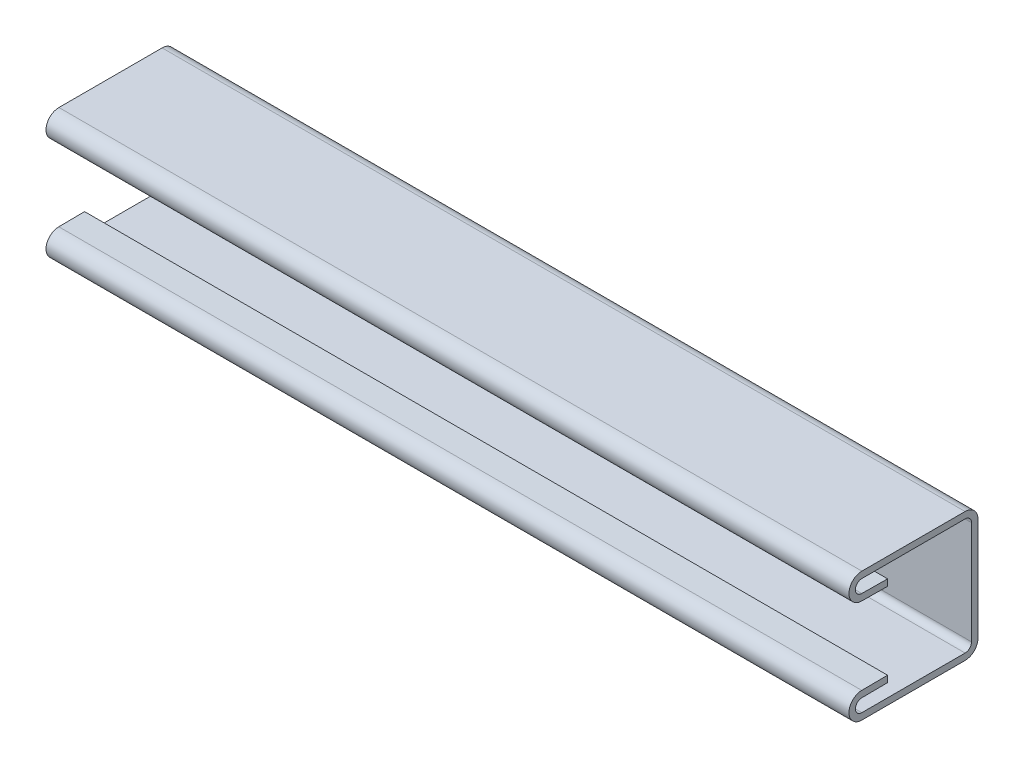
ISO-10303-21;
HEADER;
FILE_DESCRIPTION(('STEP AP214'),'2;1');
FILE_NAME('part.step','',(''),(''),'','','');
FILE_SCHEMA(('AUTOMOTIVE_DESIGN { 1 0 10303 214 1 1 1 1 }'));
ENDSEC;
DATA;
#1=APPLICATION_CONTEXT('core data for automotive mechanical design processes');
#2=APPLICATION_PROTOCOL_DEFINITION('international standard','automotive_design',2000,#1);
#3=PRODUCT_CONTEXT('',#1,'mechanical');
#4=PRODUCT('Part','Part','',(#3));
#5=PRODUCT_RELATED_PRODUCT_CATEGORY('part','',(#4));
#6=PRODUCT_DEFINITION_FORMATION('','',#4);
#7=PRODUCT_DEFINITION_CONTEXT('part definition',#1,'design');
#8=PRODUCT_DEFINITION('design','',#6,#7);
#9=PRODUCT_DEFINITION_SHAPE('','',#8);
#10=(LENGTH_UNIT() NAMED_UNIT(*) SI_UNIT(.MILLI.,.METRE.));
#11=(NAMED_UNIT(*) PLANE_ANGLE_UNIT() SI_UNIT($,.RADIAN.));
#12=(NAMED_UNIT(*) SI_UNIT($,.STERADIAN.) SOLID_ANGLE_UNIT());
#13=UNCERTAINTY_MEASURE_WITH_UNIT(LENGTH_MEASURE(1.E-05),#10,'distance_accuracy_value','');
#14=(GEOMETRIC_REPRESENTATION_CONTEXT(3) GLOBAL_UNCERTAINTY_ASSIGNED_CONTEXT((#13)) GLOBAL_UNIT_ASSIGNED_CONTEXT((#10,
#11,#12)) REPRESENTATION_CONTEXT('',''));
#15=CARTESIAN_POINT('',(0.,0.,0.));
#16=DIRECTION('',(0.,0.,1.));
#17=DIRECTION('',(1.,0.,0.));
#18=AXIS2_PLACEMENT_3D('',#15,#16,#17);
#19=CARTESIAN_POINT('',(-124.457734282082,8.,8.));
#20=DIRECTION('',(1.,0.,0.));
#21=DIRECTION('',(0.,0.,-1.));
#22=AXIS2_PLACEMENT_3D('',#19,#20,#21);
#23=CYLINDRICAL_SURFACE('',#22,2.);
#24=CARTESIAN_POINT('',(0.,8.,8.));
#25=DIRECTION('',(-1.,0.,0.));
#26=DIRECTION('',(0.,0.,-1.));
#27=AXIS2_PLACEMENT_3D('',#24,#25,#26);
#28=CIRCLE('',#27,2.);
#29=CARTESIAN_POINT('',(0.,6.00007615387166,8.01745307099674));
#30=VERTEX_POINT('',#29);
#31=CARTESIAN_POINT('',(0.,10.,8.));
#32=VERTEX_POINT('',#31);
#33=EDGE_CURVE('E267',#30,#32,#28,.T.);
#34=ORIENTED_EDGE('',*,*,#33,.T.);
#35=DIRECTION('',(1.,0.,0.));
#36=VECTOR('',#35,1.);
#37=CARTESIAN_POINT('',(-124.457734282082,10.,8.));
#38=LINE('',#37,#36);
#39=CARTESIAN_POINT('',(-124.457734282082,10.,8.));
#40=VERTEX_POINT('',#39);
#41=EDGE_CURVE('E13',#40,#32,#38,.T.);
#42=ORIENTED_EDGE('',*,*,#41,.F.);
#43=CARTESIAN_POINT('',(-124.457734282082,8.,8.));
#44=DIRECTION('',(-1.,0.,0.));
#45=DIRECTION('',(0.,0.,-1.));
#46=AXIS2_PLACEMENT_3D('',#43,#44,#45);
#47=CIRCLE('',#46,2.);
#48=CARTESIAN_POINT('',(-124.457734282082,6.00007615387166,8.01745307099674));
#49=VERTEX_POINT('',#48);
#50=EDGE_CURVE('E305',#49,#40,#47,.T.);
#51=ORIENTED_EDGE('',*,*,#50,.F.);
#52=DIRECTION('',(1.,0.,0.));
#53=VECTOR('',#52,1.);
#54=CARTESIAN_POINT('',(-124.457734282082,6.00007615387166,8.01745307099674));
#55=LINE('',#54,#53);
#56=EDGE_CURVE('E263',#49,#30,#55,.T.);
#57=ORIENTED_EDGE('',*,*,#56,.T.);
#58=EDGE_LOOP('',(#34,#42,#51,#57));
#59=FACE_BOUND('',#58,.T.);
#60=ADVANCED_FACE('F99',(#59),#23,.T.);
#61=CARTESIAN_POINT('',(-124.457734282082,10.,-8.));
#62=DIRECTION('',(0.,-1.,0.));
#63=DIRECTION('',(0.,0.,-1.));
#64=AXIS2_PLACEMENT_3D('',#61,#62,#63);
#65=PLANE('',#64);
#66=DIRECTION('',(0.,0.,-1.));
#67=VECTOR('',#66,1.);
#68=CARTESIAN_POINT('',(0.,10.,-8.));
#69=LINE('',#68,#67);
#70=CARTESIAN_POINT('',(0.,10.,-8.));
#71=VERTEX_POINT('',#70);
#72=EDGE_CURVE('E270',#32,#71,#69,.T.);
#73=ORIENTED_EDGE('',*,*,#72,.T.);
#74=DIRECTION('',(1.,0.,0.));
#75=VECTOR('',#74,1.);
#76=CARTESIAN_POINT('',(-124.457734282082,10.,-8.));
#77=LINE('',#76,#75);
#78=CARTESIAN_POINT('',(-124.457734282082,10.,-8.));
#79=VERTEX_POINT('',#78);
#80=EDGE_CURVE('E107',#79,#71,#77,.T.);
#81=ORIENTED_EDGE('',*,*,#80,.F.);
#82=DIRECTION('',(0.,0.,-1.));
#83=VECTOR('',#82,1.);
#84=CARTESIAN_POINT('',(-124.457734282082,10.,-8.));
#85=LINE('',#84,#83);
#86=EDGE_CURVE('E194',#40,#79,#85,.T.);
#87=ORIENTED_EDGE('',*,*,#86,.F.);
#88=ORIENTED_EDGE('',*,*,#41,.T.);
#89=EDGE_LOOP('',(#73,#81,#87,#88));
#90=FACE_BOUND('',#89,.T.);
#91=ADVANCED_FACE('F423',(#90),#65,.F.);
#92=CARTESIAN_POINT('',(-124.457734282082,8.,-8.));
#93=DIRECTION('',(1.,0.,0.));
#94=DIRECTION('',(0.,0.,-1.));
#95=AXIS2_PLACEMENT_3D('',#92,#93,#94);
#96=CYLINDRICAL_SURFACE('',#95,2.);
#97=CARTESIAN_POINT('',(0.,8.,-8.));
#98=DIRECTION('',(-1.,0.,0.));
#99=DIRECTION('',(0.,0.,1.));
#100=AXIS2_PLACEMENT_3D('',#97,#98,#99);
#101=CIRCLE('',#100,2.);
#102=CARTESIAN_POINT('',(0.,8.,-10.));
#103=VERTEX_POINT('',#102);
#104=EDGE_CURVE('E272',#71,#103,#101,.T.);
#105=ORIENTED_EDGE('',*,*,#104,.T.);
#106=DIRECTION('',(1.,0.,0.));
#107=VECTOR('',#106,1.);
#108=CARTESIAN_POINT('',(-124.457734282082,8.,-10.));
#109=LINE('',#108,#107);
#110=CARTESIAN_POINT('',(-124.457734282082,8.,-10.));
#111=VERTEX_POINT('',#110);
#112=EDGE_CURVE('E348',#111,#103,#109,.T.);
#113=ORIENTED_EDGE('',*,*,#112,.F.);
#114=CARTESIAN_POINT('',(-124.457734282082,8.,-8.));
#115=DIRECTION('',(-1.,0.,0.));
#116=DIRECTION('',(0.,0.,1.));
#117=AXIS2_PLACEMENT_3D('',#114,#115,#116);
#118=CIRCLE('',#117,2.);
#119=EDGE_CURVE('E356',#79,#111,#118,.T.);
#120=ORIENTED_EDGE('',*,*,#119,.F.);
#121=ORIENTED_EDGE('',*,*,#80,.T.);
#122=EDGE_LOOP('',(#105,#113,#120,#121));
#123=FACE_BOUND('',#122,.T.);
#124=ADVANCED_FACE('F354',(#123),#96,.T.);
#125=CARTESIAN_POINT('',(-124.457734282082,8.,-10.));
#126=DIRECTION('',(0.,0.,1.));
#127=DIRECTION('',(1.,0.,0.));
#128=AXIS2_PLACEMENT_3D('',#125,#126,#127);
#129=PLANE('',#128);
#130=DIRECTION('',(0.,-1.,0.));
#131=VECTOR('',#130,1.);
#132=CARTESIAN_POINT('',(0.,8.,-10.));
#133=LINE('',#132,#131);
#134=CARTESIAN_POINT('',(0.,-8.,-10.));
#135=VERTEX_POINT('',#134);
#136=EDGE_CURVE('E274',#103,#135,#133,.T.);
#137=ORIENTED_EDGE('',*,*,#136,.T.);
#138=DIRECTION('',(1.,0.,0.));
#139=VECTOR('',#138,1.);
#140=CARTESIAN_POINT('',(-124.457734282082,-8.,-10.));
#141=LINE('',#140,#139);
#142=CARTESIAN_POINT('',(-124.457734282082,-8.,-10.));
#143=VERTEX_POINT('',#142);
#144=EDGE_CURVE('E345',#143,#135,#141,.T.);
#145=ORIENTED_EDGE('',*,*,#144,.F.);
#146=DIRECTION('',(0.,-1.,0.));
#147=VECTOR('',#146,1.);
#148=CARTESIAN_POINT('',(-124.457734282082,8.,-10.));
#149=LINE('',#148,#147);
#150=EDGE_CURVE('E374',#111,#143,#149,.T.);
#151=ORIENTED_EDGE('',*,*,#150,.F.);
#152=ORIENTED_EDGE('',*,*,#112,.T.);
#153=EDGE_LOOP('',(#137,#145,#151,#152));
#154=FACE_BOUND('',#153,.T.);
#155=ADVANCED_FACE('F365',(#154),#129,.F.);
#156=CARTESIAN_POINT('',(-124.457734282082,-8.,-8.));
#157=DIRECTION('',(1.,0.,0.));
#158=DIRECTION('',(0.,0.,-1.));
#159=AXIS2_PLACEMENT_3D('',#156,#157,#158);
#160=CYLINDRICAL_SURFACE('',#159,2.);
#161=CARTESIAN_POINT('',(0.,-8.,-8.));
#162=DIRECTION('',(-1.,0.,0.));
#163=DIRECTION('',(0.,0.,-1.));
#164=AXIS2_PLACEMENT_3D('',#161,#162,#163);
#165=CIRCLE('',#164,2.);
#166=CARTESIAN_POINT('',(0.,-10.,-8.));
#167=VERTEX_POINT('',#166);
#168=EDGE_CURVE('E276',#135,#167,#165,.T.);
#169=ORIENTED_EDGE('',*,*,#168,.T.);
#170=DIRECTION('',(1.,0.,0.));
#171=VECTOR('',#170,1.);
#172=CARTESIAN_POINT('',(-124.457734282082,-10.,-8.));
#173=LINE('',#172,#171);
#174=CARTESIAN_POINT('',(-124.457734282082,-10.,-8.));
#175=VERTEX_POINT('',#174);
#176=EDGE_CURVE('E342',#175,#167,#173,.T.);
#177=ORIENTED_EDGE('',*,*,#176,.F.);
#178=CARTESIAN_POINT('',(-124.457734282082,-8.,-8.));
#179=DIRECTION('',(-1.,0.,0.));
#180=DIRECTION('',(0.,0.,-1.));
#181=AXIS2_PLACEMENT_3D('',#178,#179,#180);
#182=CIRCLE('',#181,2.);
#183=EDGE_CURVE('E371',#143,#175,#182,.T.);
#184=ORIENTED_EDGE('',*,*,#183,.F.);
#185=ORIENTED_EDGE('',*,*,#144,.T.);
#186=EDGE_LOOP('',(#169,#177,#184,#185));
#187=FACE_BOUND('',#186,.T.);
#188=ADVANCED_FACE('F369',(#187),#160,.T.);
#189=CARTESIAN_POINT('',(-124.457734282082,-10.,-8.));
#190=DIRECTION('',(0.,1.,0.));
#191=DIRECTION('',(0.,0.,1.));
#192=AXIS2_PLACEMENT_3D('',#189,#190,#191);
#193=PLANE('',#192);
#194=DIRECTION('',(0.,0.,1.));
#195=VECTOR('',#194,1.);
#196=CARTESIAN_POINT('',(0.,-10.,-8.));
#197=LINE('',#196,#195);
#198=CARTESIAN_POINT('',(0.,-10.,8.));
#199=VERTEX_POINT('',#198);
#200=EDGE_CURVE('E278',#167,#199,#197,.T.);
#201=ORIENTED_EDGE('',*,*,#200,.T.);
#202=DIRECTION('',(1.,0.,0.));
#203=VECTOR('',#202,1.);
#204=CARTESIAN_POINT('',(-124.457734282082,-10.,8.));
#205=LINE('',#204,#203);
#206=CARTESIAN_POINT('',(-124.457734282082,-10.,8.));
#207=VERTEX_POINT('',#206);
#208=EDGE_CURVE('E339',#207,#199,#205,.T.);
#209=ORIENTED_EDGE('',*,*,#208,.F.);
#210=DIRECTION('',(0.,0.,1.));
#211=VECTOR('',#210,1.);
#212=CARTESIAN_POINT('',(-124.457734282082,-10.,-8.));
#213=LINE('',#212,#211);
#214=EDGE_CURVE('E373',#175,#207,#213,.T.);
#215=ORIENTED_EDGE('',*,*,#214,.F.);
#216=ORIENTED_EDGE('',*,*,#176,.T.);
#217=EDGE_LOOP('',(#201,#209,#215,#216));
#218=FACE_BOUND('',#217,.T.);
#219=ADVANCED_FACE('F436',(#218),#193,.F.);
#220=CARTESIAN_POINT('',(-124.457734282082,-8.,8.));
#221=DIRECTION('',(1.,0.,0.));
#222=DIRECTION('',(0.,0.,-1.));
#223=AXIS2_PLACEMENT_3D('',#220,#221,#222);
#224=CYLINDRICAL_SURFACE('',#223,2.);
#225=CARTESIAN_POINT('',(0.,-8.,8.));
#226=DIRECTION('',(-1.,0.,0.));
#227=DIRECTION('',(0.,0.,1.));
#228=AXIS2_PLACEMENT_3D('',#225,#226,#227);
#229=CIRCLE('',#228,2.);
#230=CARTESIAN_POINT('',(0.,-6.00007615387166,8.01745307099674));
#231=VERTEX_POINT('',#230);
#232=EDGE_CURVE('E280',#199,#231,#229,.T.);
#233=ORIENTED_EDGE('',*,*,#232,.T.);
#234=DIRECTION('',(1.,0.,0.));
#235=VECTOR('',#234,1.);
#236=CARTESIAN_POINT('',(-124.457734282082,-6.00007615387166,8.01745307099674));
#237=LINE('',#236,#235);
#238=CARTESIAN_POINT('',(-124.457734282082,-6.00007615387166,8.01745307099674));
#239=VERTEX_POINT('',#238);
#240=EDGE_CURVE('E336',#239,#231,#237,.T.);
#241=ORIENTED_EDGE('',*,*,#240,.F.);
#242=CARTESIAN_POINT('',(-124.457734282082,-8.,8.));
#243=DIRECTION('',(-1.,0.,0.));
#244=DIRECTION('',(0.,0.,1.));
#245=AXIS2_PLACEMENT_3D('',#242,#243,#244);
#246=CIRCLE('',#245,2.);
#247=EDGE_CURVE('E376',#207,#239,#246,.T.);
#248=ORIENTED_EDGE('',*,*,#247,.F.);
#249=ORIENTED_EDGE('',*,*,#208,.T.);
#250=EDGE_LOOP('',(#233,#241,#248,#249));
#251=FACE_BOUND('',#250,.T.);
#252=ADVANCED_FACE('F439',(#251),#224,.T.);
#253=CARTESIAN_POINT('',(-124.457734282082,-6.00007615387166,8.01745307099674));
#254=DIRECTION('',(0.,-0.999961923064171,-0.00872653549836713));
#255=DIRECTION('',(0.,0.00872653549836714,-0.999961923064171));
#256=AXIS2_PLACEMENT_3D('',#253,#254,#255);
#257=PLANE('',#256);
#258=DIRECTION('',(0.,0.00872653549836713,-0.999961923064171));
#259=VECTOR('',#258,1.);
#260=CARTESIAN_POINT('',(0.,-6.00007615387166,8.01745307099674));
#261=LINE('',#260,#259);
#262=CARTESIAN_POINT('',(0.,-5.96517001187819,4.01760537874005));
#263=VERTEX_POINT('',#262);
#264=EDGE_CURVE('E282',#231,#263,#261,.T.);
#265=ORIENTED_EDGE('',*,*,#264,.T.);
#266=DIRECTION('',(1.,0.,0.));
#267=VECTOR('',#266,1.);
#268=CARTESIAN_POINT('',(-124.457734282082,-5.96517001187819,4.01760537874005));
#269=LINE('',#268,#267);
#270=CARTESIAN_POINT('',(-124.457734282082,-5.96517001187819,4.01760537874005));
#271=VERTEX_POINT('',#270);
#272=EDGE_CURVE('E333',#271,#263,#269,.T.);
#273=ORIENTED_EDGE('',*,*,#272,.F.);
#274=DIRECTION('',(0.,0.00872653549836713,-0.999961923064171));
#275=VECTOR('',#274,1.);
#276=CARTESIAN_POINT('',(-124.457734282082,-6.00007615387166,8.01745307099674));
#277=LINE('',#276,#275);
#278=EDGE_CURVE('E382',#239,#271,#277,.T.);
#279=ORIENTED_EDGE('',*,*,#278,.F.);
#280=ORIENTED_EDGE('',*,*,#240,.T.);
#281=EDGE_LOOP('',(#265,#273,#279,#280));
#282=FACE_BOUND('',#281,.T.);
#283=ADVANCED_FACE('F443',(#282),#257,.F.);
#284=CARTESIAN_POINT('',(-124.457734282082,-5.96517001187819,4.01760537874005));
#285=DIRECTION('',(0.,-0.00872653549836582,0.999961923064171));
#286=DIRECTION('',(0.,-0.999961923064172,-0.00872653549836583));
#287=AXIS2_PLACEMENT_3D('',#284,#285,#286);
#288=PLANE('',#287);
#289=DIRECTION('',(0.,-0.999961923064171,-0.00872653549836582));
#290=VECTOR('',#289,1.);
#291=CARTESIAN_POINT('',(0.,-5.96517001187819,4.01760537874005));
#292=LINE('',#291,#290);
#293=CARTESIAN_POINT('',(0.,-6.96513193494236,4.00887884324168));
#294=VERTEX_POINT('',#293);
#295=EDGE_CURVE('E284',#263,#294,#292,.T.);
#296=ORIENTED_EDGE('',*,*,#295,.T.);
#297=DIRECTION('',(1.,0.,0.));
#298=VECTOR('',#297,1.);
#299=CARTESIAN_POINT('',(-124.457734282082,-6.96513193494236,4.00887884324168));
#300=LINE('',#299,#298);
#301=CARTESIAN_POINT('',(-124.457734282082,-6.96513193494236,4.00887884324168));
#302=VERTEX_POINT('',#301);
#303=EDGE_CURVE('E330',#302,#294,#300,.T.);
#304=ORIENTED_EDGE('',*,*,#303,.F.);
#305=DIRECTION('',(0.,-0.999961923064171,-0.00872653549836582));
#306=VECTOR('',#305,1.);
#307=CARTESIAN_POINT('',(-124.457734282082,-5.96517001187819,4.01760537874005));
#308=LINE('',#307,#306);
#309=EDGE_CURVE('E384',#271,#302,#308,.T.);
#310=ORIENTED_EDGE('',*,*,#309,.F.);
#311=ORIENTED_EDGE('',*,*,#272,.T.);
#312=EDGE_LOOP('',(#296,#304,#310,#311));
#313=FACE_BOUND('',#312,.T.);
#314=ADVANCED_FACE('F447',(#313),#288,.F.);
#315=CARTESIAN_POINT('',(-124.457734282082,-7.00003807693583,8.00872653549837));
#316=DIRECTION('',(0.,0.999961923064171,0.00872653549836714));
#317=DIRECTION('',(0.,-0.00872653549836714,0.999961923064171));
#318=AXIS2_PLACEMENT_3D('',#315,#316,#317);
#319=PLANE('',#318);
#320=DIRECTION('',(0.,-0.00872653549836714,0.999961923064171));
#321=VECTOR('',#320,1.);
#322=CARTESIAN_POINT('',(0.,-7.00003807693583,8.00872653549837));
#323=LINE('',#322,#321);
#324=CARTESIAN_POINT('',(0.,-7.00003807693583,8.00872653549837));
#325=VERTEX_POINT('',#324);
#326=EDGE_CURVE('E286',#294,#325,#323,.T.);
#327=ORIENTED_EDGE('',*,*,#326,.T.);
#328=DIRECTION('',(1.,0.,0.));
#329=VECTOR('',#328,1.);
#330=CARTESIAN_POINT('',(-124.457734282082,-7.00003807693583,8.00872653549837));
#331=LINE('',#330,#329);
#332=CARTESIAN_POINT('',(-124.457734282082,-7.00003807693583,8.00872653549837));
#333=VERTEX_POINT('',#332);
#334=EDGE_CURVE('E327',#333,#325,#331,.T.);
#335=ORIENTED_EDGE('',*,*,#334,.F.);
#336=DIRECTION('',(0.,-0.00872653549836714,0.999961923064171));
#337=VECTOR('',#336,1.);
#338=CARTESIAN_POINT('',(-124.457734282082,-7.00003807693583,8.00872653549837));
#339=LINE('',#338,#337);
#340=EDGE_CURVE('E386',#302,#333,#339,.T.);
#341=ORIENTED_EDGE('',*,*,#340,.F.);
#342=ORIENTED_EDGE('',*,*,#303,.T.);
#343=EDGE_LOOP('',(#327,#335,#341,#342));
#344=FACE_BOUND('',#343,.T.);
#345=ADVANCED_FACE('F451',(#344),#319,.F.);
#346=CARTESIAN_POINT('',(-124.457734282082,-8.,8.));
#347=DIRECTION('',(1.,0.,0.));
#348=DIRECTION('',(0.,0.,-1.));
#349=AXIS2_PLACEMENT_3D('',#346,#347,#348);
#350=CYLINDRICAL_SURFACE('',#349,0.999999999999999);
#351=CARTESIAN_POINT('',(0.,-8.,8.));
#352=DIRECTION('',(1.,0.,0.));
#353=DIRECTION('',(0.,0.,1.));
#354=AXIS2_PLACEMENT_3D('',#351,#352,#353);
#355=CIRCLE('',#354,0.999999999999999);
#356=CARTESIAN_POINT('',(0.,-9.,8.));
#357=VERTEX_POINT('',#356);
#358=EDGE_CURVE('E288',#325,#357,#355,.T.);
#359=ORIENTED_EDGE('',*,*,#358,.T.);
#360=DIRECTION('',(1.,0.,0.));
#361=VECTOR('',#360,1.);
#362=CARTESIAN_POINT('',(-124.457734282082,-9.,8.));
#363=LINE('',#362,#361);
#364=CARTESIAN_POINT('',(-124.457734282082,-9.,8.));
#365=VERTEX_POINT('',#364);
#366=EDGE_CURVE('E324',#365,#357,#363,.T.);
#367=ORIENTED_EDGE('',*,*,#366,.F.);
#368=CARTESIAN_POINT('',(-124.457734282082,-8.,8.));
#369=DIRECTION('',(1.,0.,0.));
#370=DIRECTION('',(0.,0.,1.));
#371=AXIS2_PLACEMENT_3D('',#368,#369,#370);
#372=CIRCLE('',#371,0.999999999999999);
#373=EDGE_CURVE('E388',#333,#365,#372,.T.);
#374=ORIENTED_EDGE('',*,*,#373,.F.);
#375=ORIENTED_EDGE('',*,*,#334,.T.);
#376=EDGE_LOOP('',(#359,#367,#374,#375));
#377=FACE_BOUND('',#376,.T.);
#378=ADVANCED_FACE('F455',(#377),#350,.F.);
#379=CARTESIAN_POINT('',(-124.457734282082,-9.,-8.));
#380=DIRECTION('',(0.,-1.,0.));
#381=DIRECTION('',(0.,0.,-1.));
#382=AXIS2_PLACEMENT_3D('',#379,#380,#381);
#383=PLANE('',#382);
#384=DIRECTION('',(0.,0.,-1.));
#385=VECTOR('',#384,1.);
#386=CARTESIAN_POINT('',(0.,-9.,-8.));
#387=LINE('',#386,#385);
#388=CARTESIAN_POINT('',(0.,-9.,-8.));
#389=VERTEX_POINT('',#388);
#390=EDGE_CURVE('E290',#357,#389,#387,.T.);
#391=ORIENTED_EDGE('',*,*,#390,.T.);
#392=DIRECTION('',(1.,0.,0.));
#393=VECTOR('',#392,1.);
#394=CARTESIAN_POINT('',(-124.457734282082,-9.,-8.));
#395=LINE('',#394,#393);
#396=CARTESIAN_POINT('',(-124.457734282082,-9.,-8.));
#397=VERTEX_POINT('',#396);
#398=EDGE_CURVE('E321',#397,#389,#395,.T.);
#399=ORIENTED_EDGE('',*,*,#398,.F.);
#400=DIRECTION('',(0.,0.,-1.));
#401=VECTOR('',#400,1.);
#402=CARTESIAN_POINT('',(-124.457734282082,-9.,-8.));
#403=LINE('',#402,#401);
#404=EDGE_CURVE('E390',#365,#397,#403,.T.);
#405=ORIENTED_EDGE('',*,*,#404,.F.);
#406=ORIENTED_EDGE('',*,*,#366,.T.);
#407=EDGE_LOOP('',(#391,#399,#405,#406));
#408=FACE_BOUND('',#407,.T.);
#409=ADVANCED_FACE('F459',(#408),#383,.F.);
#410=CARTESIAN_POINT('',(-124.457734282082,-8.,-8.));
#411=DIRECTION('',(1.,0.,0.));
#412=DIRECTION('',(0.,0.,-1.));
#413=AXIS2_PLACEMENT_3D('',#410,#411,#412);
#414=CYLINDRICAL_SURFACE('',#413,1.);
#415=CARTESIAN_POINT('',(0.,-8.,-8.));
#416=DIRECTION('',(1.,0.,0.));
#417=DIRECTION('',(0.,0.,-1.));
#418=AXIS2_PLACEMENT_3D('',#415,#416,#417);
#419=CIRCLE('',#418,1.);
#420=CARTESIAN_POINT('',(0.,-8.,-9.));
#421=VERTEX_POINT('',#420);
#422=EDGE_CURVE('E292',#389,#421,#419,.T.);
#423=ORIENTED_EDGE('',*,*,#422,.T.);
#424=DIRECTION('',(1.,0.,0.));
#425=VECTOR('',#424,1.);
#426=CARTESIAN_POINT('',(-124.457734282082,-8.,-9.));
#427=LINE('',#426,#425);
#428=CARTESIAN_POINT('',(-124.457734282082,-8.,-9.));
#429=VERTEX_POINT('',#428);
#430=EDGE_CURVE('E318',#429,#421,#427,.T.);
#431=ORIENTED_EDGE('',*,*,#430,.F.);
#432=CARTESIAN_POINT('',(-124.457734282082,-8.,-8.));
#433=DIRECTION('',(1.,0.,0.));
#434=DIRECTION('',(0.,0.,-1.));
#435=AXIS2_PLACEMENT_3D('',#432,#433,#434);
#436=CIRCLE('',#435,1.);
#437=EDGE_CURVE('E392',#397,#429,#436,.T.);
#438=ORIENTED_EDGE('',*,*,#437,.F.);
#439=ORIENTED_EDGE('',*,*,#398,.T.);
#440=EDGE_LOOP('',(#423,#431,#438,#439));
#441=FACE_BOUND('',#440,.T.);
#442=ADVANCED_FACE('F463',(#441),#414,.F.);
#443=CARTESIAN_POINT('',(-124.457734282082,8.,-9.));
#444=DIRECTION('',(0.,0.,-1.));
#445=DIRECTION('',(-1.,0.,0.));
#446=AXIS2_PLACEMENT_3D('',#443,#444,#445);
#447=PLANE('',#446);
#448=DIRECTION('',(0.,1.,0.));
#449=VECTOR('',#448,1.);
#450=CARTESIAN_POINT('',(0.,8.,-9.));
#451=LINE('',#450,#449);
#452=CARTESIAN_POINT('',(0.,8.,-9.));
#453=VERTEX_POINT('',#452);
#454=EDGE_CURVE('E294',#421,#453,#451,.T.);
#455=ORIENTED_EDGE('',*,*,#454,.T.);
#456=DIRECTION('',(1.,0.,0.));
#457=VECTOR('',#456,1.);
#458=CARTESIAN_POINT('',(-124.457734282082,8.,-9.));
#459=LINE('',#458,#457);
#460=CARTESIAN_POINT('',(-124.457734282082,8.,-9.));
#461=VERTEX_POINT('',#460);
#462=EDGE_CURVE('E315',#461,#453,#459,.T.);
#463=ORIENTED_EDGE('',*,*,#462,.F.);
#464=DIRECTION('',(0.,1.,0.));
#465=VECTOR('',#464,1.);
#466=CARTESIAN_POINT('',(-124.457734282082,8.,-9.));
#467=LINE('',#466,#465);
#468=EDGE_CURVE('E394',#429,#461,#467,.T.);
#469=ORIENTED_EDGE('',*,*,#468,.F.);
#470=ORIENTED_EDGE('',*,*,#430,.T.);
#471=EDGE_LOOP('',(#455,#463,#469,#470));
#472=FACE_BOUND('',#471,.T.);
#473=ADVANCED_FACE('F467',(#472),#447,.F.);
#474=CARTESIAN_POINT('',(-124.457734282082,8.,-8.));
#475=DIRECTION('',(1.,0.,0.));
#476=DIRECTION('',(0.,0.,-1.));
#477=AXIS2_PLACEMENT_3D('',#474,#475,#476);
#478=CYLINDRICAL_SURFACE('',#477,1.);
#479=CARTESIAN_POINT('',(0.,8.,-8.));
#480=DIRECTION('',(1.,0.,0.));
#481=DIRECTION('',(0.,0.,1.));
#482=AXIS2_PLACEMENT_3D('',#479,#480,#481);
#483=CIRCLE('',#482,1.);
#484=CARTESIAN_POINT('',(0.,9.,-8.));
#485=VERTEX_POINT('',#484);
#486=EDGE_CURVE('E296',#453,#485,#483,.T.);
#487=ORIENTED_EDGE('',*,*,#486,.T.);
#488=DIRECTION('',(1.,0.,0.));
#489=VECTOR('',#488,1.);
#490=CARTESIAN_POINT('',(-124.457734282082,9.,-8.));
#491=LINE('',#490,#489);
#492=CARTESIAN_POINT('',(-124.457734282082,9.,-8.));
#493=VERTEX_POINT('',#492);
#494=EDGE_CURVE('E312',#493,#485,#491,.T.);
#495=ORIENTED_EDGE('',*,*,#494,.F.);
#496=CARTESIAN_POINT('',(-124.457734282082,8.,-8.));
#497=DIRECTION('',(1.,0.,0.));
#498=DIRECTION('',(0.,0.,1.));
#499=AXIS2_PLACEMENT_3D('',#496,#497,#498);
#500=CIRCLE('',#499,1.);
#501=EDGE_CURVE('E396',#461,#493,#500,.T.);
#502=ORIENTED_EDGE('',*,*,#501,.F.);
#503=ORIENTED_EDGE('',*,*,#462,.T.);
#504=EDGE_LOOP('',(#487,#495,#502,#503));
#505=FACE_BOUND('',#504,.T.);
#506=ADVANCED_FACE('F471',(#505),#478,.F.);
#507=CARTESIAN_POINT('',(-124.457734282082,9.,-8.));
#508=DIRECTION('',(0.,1.,0.));
#509=DIRECTION('',(0.,0.,1.));
#510=AXIS2_PLACEMENT_3D('',#507,#508,#509);
#511=PLANE('',#510);
#512=DIRECTION('',(0.,0.,1.));
#513=VECTOR('',#512,1.);
#514=CARTESIAN_POINT('',(0.,9.,-8.));
#515=LINE('',#514,#513);
#516=CARTESIAN_POINT('',(0.,9.,8.));
#517=VERTEX_POINT('',#516);
#518=EDGE_CURVE('E298',#485,#517,#515,.T.);
#519=ORIENTED_EDGE('',*,*,#518,.T.);
#520=DIRECTION('',(1.,0.,0.));
#521=VECTOR('',#520,1.);
#522=CARTESIAN_POINT('',(-124.457734282082,9.,8.));
#523=LINE('',#522,#521);
#524=CARTESIAN_POINT('',(-124.457734282082,9.,8.));
#525=VERTEX_POINT('',#524);
#526=EDGE_CURVE('E309',#525,#517,#523,.T.);
#527=ORIENTED_EDGE('',*,*,#526,.F.);
#528=DIRECTION('',(0.,0.,1.));
#529=VECTOR('',#528,1.);
#530=CARTESIAN_POINT('',(-124.457734282082,9.,-8.));
#531=LINE('',#530,#529);
#532=EDGE_CURVE('E398',#493,#525,#531,.T.);
#533=ORIENTED_EDGE('',*,*,#532,.F.);
#534=ORIENTED_EDGE('',*,*,#494,.T.);
#535=EDGE_LOOP('',(#519,#527,#533,#534));
#536=FACE_BOUND('',#535,.T.);
#537=ADVANCED_FACE('F404',(#536),#511,.F.);
#538=CARTESIAN_POINT('',(-124.457734282082,8.,8.));
#539=DIRECTION('',(1.,0.,0.));
#540=DIRECTION('',(0.,0.,-1.));
#541=AXIS2_PLACEMENT_3D('',#538,#539,#540);
#542=CYLINDRICAL_SURFACE('',#541,0.999999999999999);
#543=CARTESIAN_POINT('',(0.,8.,8.));
#544=DIRECTION('',(1.,0.,0.));
#545=DIRECTION('',(0.,0.,-1.));
#546=AXIS2_PLACEMENT_3D('',#543,#544,#545);
#547=CIRCLE('',#546,0.999999999999999);
#548=CARTESIAN_POINT('',(0.,7.00003807693583,8.00872653549837));
#549=VERTEX_POINT('',#548);
#550=EDGE_CURVE('E300',#517,#549,#547,.T.);
#551=ORIENTED_EDGE('',*,*,#550,.T.);
#552=DIRECTION('',(1.,0.,0.));
#553=VECTOR('',#552,1.);
#554=CARTESIAN_POINT('',(-124.457734282082,7.00003807693583,8.00872653549837));
#555=LINE('',#554,#553);
#556=CARTESIAN_POINT('',(-124.457734282082,7.00003807693583,8.00872653549837));
#557=VERTEX_POINT('',#556);
#558=EDGE_CURVE('E258',#557,#549,#555,.T.);
#559=ORIENTED_EDGE('',*,*,#558,.F.);
#560=CARTESIAN_POINT('',(-124.457734282082,8.,8.));
#561=DIRECTION('',(1.,0.,0.));
#562=DIRECTION('',(0.,0.,-1.));
#563=AXIS2_PLACEMENT_3D('',#560,#561,#562);
#564=CIRCLE('',#563,0.999999999999999);
#565=EDGE_CURVE('E249',#525,#557,#564,.T.);
#566=ORIENTED_EDGE('',*,*,#565,.F.);
#567=ORIENTED_EDGE('',*,*,#526,.T.);
#568=EDGE_LOOP('',(#551,#559,#566,#567));
#569=FACE_BOUND('',#568,.T.);
#570=ADVANCED_FACE('F408',(#569),#542,.F.);
#571=CARTESIAN_POINT('',(-124.457734282082,7.00003807693583,8.00872653549837));
#572=DIRECTION('',(0.,-0.999961923064171,0.00872653549836714));
#573=DIRECTION('',(0.,-0.00872653549836714,-0.999961923064171));
#574=AXIS2_PLACEMENT_3D('',#571,#572,#573);
#575=PLANE('',#574);
#576=DIRECTION('',(0.,-0.00872653549836714,-0.999961923064171));
#577=VECTOR('',#576,1.);
#578=CARTESIAN_POINT('',(0.,7.00003807693583,8.00872653549837));
#579=LINE('',#578,#577);
#580=CARTESIAN_POINT('',(0.,6.96513193494236,4.00887884324168));
#581=VERTEX_POINT('',#580);
#582=EDGE_CURVE('E257',#549,#581,#579,.T.);
#583=ORIENTED_EDGE('',*,*,#582,.T.);
#584=DIRECTION('',(1.,0.,0.));
#585=VECTOR('',#584,1.);
#586=CARTESIAN_POINT('',(-124.457734282082,6.96513193494236,4.00887884324168));
#587=LINE('',#586,#585);
#588=CARTESIAN_POINT('',(-124.457734282082,6.96513193494236,4.00887884324168));
#589=VERTEX_POINT('',#588);
#590=EDGE_CURVE('E254',#589,#581,#587,.T.);
#591=ORIENTED_EDGE('',*,*,#590,.F.);
#592=DIRECTION('',(0.,-0.00872653549836714,-0.999961923064171));
#593=VECTOR('',#592,1.);
#594=CARTESIAN_POINT('',(-124.457734282082,7.00003807693583,8.00872653549837));
#595=LINE('',#594,#593);
#596=EDGE_CURVE('E243',#557,#589,#595,.T.);
#597=ORIENTED_EDGE('',*,*,#596,.F.);
#598=ORIENTED_EDGE('',*,*,#558,.T.);
#599=EDGE_LOOP('',(#583,#591,#597,#598));
#600=FACE_BOUND('',#599,.T.);
#601=ADVANCED_FACE('F255',(#600),#575,.F.);
#602=CARTESIAN_POINT('',(-124.457734282082,5.96517001187819,4.01760537874005));
#603=DIRECTION('',(0.,0.00872653549836669,0.999961923064171));
#604=DIRECTION('',(0.,-0.999961923064172,0.00872653549836669));
#605=AXIS2_PLACEMENT_3D('',#602,#603,#604);
#606=PLANE('',#605);
#607=DIRECTION('',(0.,-0.999961923064171,0.00872653549836669));
#608=VECTOR('',#607,1.);
#609=CARTESIAN_POINT('',(0.,5.96517001187819,4.01760537874005));
#610=LINE('',#609,#608);
#611=CARTESIAN_POINT('',(0.,5.96517001187819,4.01760537874005));
#612=VERTEX_POINT('',#611);
#613=EDGE_CURVE('E180',#581,#612,#610,.T.);
#614=ORIENTED_EDGE('',*,*,#613,.T.);
#615=DIRECTION('',(1.,0.,0.));
#616=VECTOR('',#615,1.);
#617=CARTESIAN_POINT('',(-124.457734282082,5.96517001187819,4.01760537874005));
#618=LINE('',#617,#616);
#619=CARTESIAN_POINT('',(-124.457734282082,5.96517001187819,4.01760537874005));
#620=VERTEX_POINT('',#619);
#621=EDGE_CURVE('E259',#620,#612,#618,.T.);
#622=ORIENTED_EDGE('',*,*,#621,.F.);
#623=DIRECTION('',(0.,-0.999961923064171,0.00872653549836669));
#624=VECTOR('',#623,1.);
#625=CARTESIAN_POINT('',(-124.457734282082,5.96517001187819,4.01760537874005));
#626=LINE('',#625,#624);
#627=EDGE_CURVE('E247',#589,#620,#626,.T.);
#628=ORIENTED_EDGE('',*,*,#627,.F.);
#629=ORIENTED_EDGE('',*,*,#590,.T.);
#630=EDGE_LOOP('',(#614,#622,#628,#629));
#631=FACE_BOUND('',#630,.T.);
#632=ADVANCED_FACE('F261',(#631),#606,.F.);
#633=CARTESIAN_POINT('',(-124.457734282082,6.00007615387166,8.01745307099674));
#634=DIRECTION('',(0.,0.999961923064171,-0.00872653549836692));
#635=DIRECTION('',(0.,0.00872653549836692,0.999961923064171));
#636=AXIS2_PLACEMENT_3D('',#633,#634,#635);
#637=PLANE('',#636);
#638=DIRECTION('',(0.,0.00872653549836692,0.999961923064171));
#639=VECTOR('',#638,1.);
#640=CARTESIAN_POINT('',(0.,6.00007615387166,8.01745307099674));
#641=LINE('',#640,#639);
#642=EDGE_CURVE('E186',#612,#30,#641,.T.);
#643=ORIENTED_EDGE('',*,*,#642,.T.);
#644=ORIENTED_EDGE('',*,*,#56,.F.);
#645=DIRECTION('',(0.,0.00872653549836692,0.999961923064171));
#646=VECTOR('',#645,1.);
#647=CARTESIAN_POINT('',(-124.457734282082,6.00007615387166,8.01745307099674));
#648=LINE('',#647,#646);
#649=EDGE_CURVE('E115',#620,#49,#648,.T.);
#650=ORIENTED_EDGE('',*,*,#649,.F.);
#651=ORIENTED_EDGE('',*,*,#621,.T.);
#652=EDGE_LOOP('',(#643,#644,#650,#651));
#653=FACE_BOUND('',#652,.T.);
#654=ADVANCED_FACE('F412',(#653),#637,.F.);
#655=CARTESIAN_POINT('',(-124.457734282082,8.,8.));
#656=DIRECTION('',(1.,0.,0.));
#657=DIRECTION('',(0.,0.,-1.));
#658=AXIS2_PLACEMENT_3D('',#655,#656,#657);
#659=PLANE('',#658);
#660=ORIENTED_EDGE('',*,*,#50,.T.);
#661=ORIENTED_EDGE('',*,*,#86,.T.);
#662=ORIENTED_EDGE('',*,*,#119,.T.);
#663=ORIENTED_EDGE('',*,*,#150,.T.);
#664=ORIENTED_EDGE('',*,*,#183,.T.);
#665=ORIENTED_EDGE('',*,*,#214,.T.);
#666=ORIENTED_EDGE('',*,*,#247,.T.);
#667=ORIENTED_EDGE('',*,*,#278,.T.);
#668=ORIENTED_EDGE('',*,*,#309,.T.);
#669=ORIENTED_EDGE('',*,*,#340,.T.);
#670=ORIENTED_EDGE('',*,*,#373,.T.);
#671=ORIENTED_EDGE('',*,*,#404,.T.);
#672=ORIENTED_EDGE('',*,*,#437,.T.);
#673=ORIENTED_EDGE('',*,*,#468,.T.);
#674=ORIENTED_EDGE('',*,*,#501,.T.);
#675=ORIENTED_EDGE('',*,*,#532,.T.);
#676=ORIENTED_EDGE('',*,*,#565,.T.);
#677=ORIENTED_EDGE('',*,*,#596,.T.);
#678=ORIENTED_EDGE('',*,*,#627,.T.);
#679=ORIENTED_EDGE('',*,*,#649,.T.);
#680=EDGE_LOOP('',(#660,#661,#662,#663,#664,#665,#666,#667,#668,#669,#670,#671,#672,#673,#674,
#675,#676,#677,#678,#679));
#681=FACE_BOUND('',#680,.T.);
#682=ADVANCED_FACE('F245',(#681),#659,.F.);
#683=CARTESIAN_POINT('',(0.,8.,8.));
#684=DIRECTION('',(1.,0.,0.));
#685=DIRECTION('',(0.,0.,-1.));
#686=AXIS2_PLACEMENT_3D('',#683,#684,#685);
#687=PLANE('',#686);
#688=ORIENTED_EDGE('',*,*,#33,.F.);
#689=ORIENTED_EDGE('',*,*,#642,.F.);
#690=ORIENTED_EDGE('',*,*,#613,.F.);
#691=ORIENTED_EDGE('',*,*,#582,.F.);
#692=ORIENTED_EDGE('',*,*,#550,.F.);
#693=ORIENTED_EDGE('',*,*,#518,.F.);
#694=ORIENTED_EDGE('',*,*,#486,.F.);
#695=ORIENTED_EDGE('',*,*,#454,.F.);
#696=ORIENTED_EDGE('',*,*,#422,.F.);
#697=ORIENTED_EDGE('',*,*,#390,.F.);
#698=ORIENTED_EDGE('',*,*,#358,.F.);
#699=ORIENTED_EDGE('',*,*,#326,.F.);
#700=ORIENTED_EDGE('',*,*,#295,.F.);
#701=ORIENTED_EDGE('',*,*,#264,.F.);
#702=ORIENTED_EDGE('',*,*,#232,.F.);
#703=ORIENTED_EDGE('',*,*,#200,.F.);
#704=ORIENTED_EDGE('',*,*,#168,.F.);
#705=ORIENTED_EDGE('',*,*,#136,.F.);
#706=ORIENTED_EDGE('',*,*,#104,.F.);
#707=ORIENTED_EDGE('',*,*,#72,.F.);
#708=EDGE_LOOP('',(#688,#689,#690,#691,#692,#693,#694,#695,#696,#697,#698,#699,#700,#701,#702,
#703,#704,#705,#706,#707));
#709=FACE_BOUND('',#708,.T.);
#710=ADVANCED_FACE('F360',(#709),#687,.T.);
#711=CLOSED_SHELL('',(#60,#91,#124,#155,#188,#219,#252,#283,#314,#345,#378,#409,#442,#473,#506,
#537,#570,#601,#632,#654,#682,#710));
#712=MANIFOLD_SOLID_BREP('B2',#711);
#713=ADVANCED_BREP_SHAPE_REPRESENTATION('',(#18,#712),#14);
#714=SHAPE_DEFINITION_REPRESENTATION(#9,#713);
ENDSEC;
END-ISO-10303-21;
